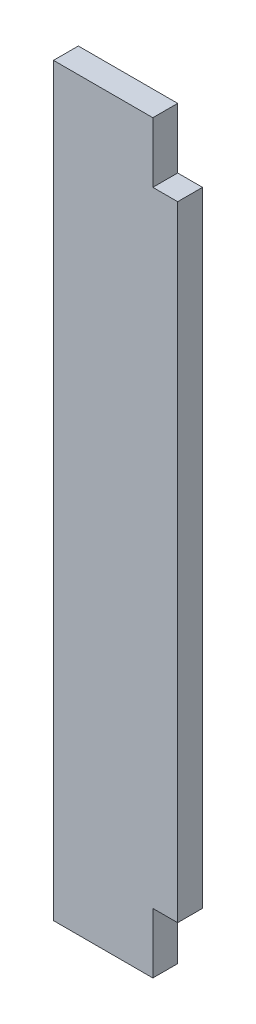
ISO-10303-21;
HEADER;
FILE_DESCRIPTION(('STEP AP214'),'2;1');
FILE_NAME('part.step','',(''),(''),'','','');
FILE_SCHEMA(('AUTOMOTIVE_DESIGN { 1 0 10303 214 1 1 1 1 }'));
ENDSEC;
DATA;
#1=APPLICATION_CONTEXT('core data for automotive mechanical design processes');
#2=APPLICATION_PROTOCOL_DEFINITION('international standard','automotive_design',2000,#1);
#3=PRODUCT_CONTEXT('',#1,'mechanical');
#4=PRODUCT('Part','Part','',(#3));
#5=PRODUCT_RELATED_PRODUCT_CATEGORY('part','',(#4));
#6=PRODUCT_DEFINITION_FORMATION('','',#4);
#7=PRODUCT_DEFINITION_CONTEXT('part definition',#1,'design');
#8=PRODUCT_DEFINITION('design','',#6,#7);
#9=PRODUCT_DEFINITION_SHAPE('','',#8);
#10=(LENGTH_UNIT() NAMED_UNIT(*) SI_UNIT(.MILLI.,.METRE.));
#11=(NAMED_UNIT(*) PLANE_ANGLE_UNIT() SI_UNIT($,.RADIAN.));
#12=(NAMED_UNIT(*) SI_UNIT($,.STERADIAN.) SOLID_ANGLE_UNIT());
#13=UNCERTAINTY_MEASURE_WITH_UNIT(LENGTH_MEASURE(1.E-05),#10,'distance_accuracy_value','');
#14=(GEOMETRIC_REPRESENTATION_CONTEXT(3) GLOBAL_UNCERTAINTY_ASSIGNED_CONTEXT((#13)) GLOBAL_UNIT_ASSIGNED_CONTEXT((#10,
#11,#12)) REPRESENTATION_CONTEXT('',''));
#15=CARTESIAN_POINT('',(0.,0.,0.));
#16=DIRECTION('',(0.,0.,1.));
#17=DIRECTION('',(1.,0.,0.));
#18=AXIS2_PLACEMENT_3D('',#15,#16,#17);
#19=CARTESIAN_POINT('',(11403.5416666658,-5808.6625,-17.78));
#20=DIRECTION('',(-1.,0.,0.));
#21=DIRECTION('',(0.,0.,1.));
#22=AXIS2_PLACEMENT_3D('',#19,#20,#21);
#23=PLANE('',#22);
#24=DIRECTION('',(0.,-1.,0.));
#25=VECTOR('',#24,1.);
#26=CARTESIAN_POINT('',(11403.5416666658,-5808.6625,0.));
#27=LINE('',#26,#25);
#28=CARTESIAN_POINT('',(11403.5416666658,-5808.6625,0.));
#29=VERTEX_POINT('',#28);
#30=CARTESIAN_POINT('',(11403.5416666658,-6342.0625,0.));
#31=VERTEX_POINT('',#30);
#32=EDGE_CURVE('E128',#29,#31,#27,.T.);
#33=ORIENTED_EDGE('',*,*,#32,.F.);
#34=DIRECTION('',(0.,0.,1.));
#35=VECTOR('',#34,1.);
#36=CARTESIAN_POINT('',(11403.5416666658,-5808.6625,-17.78));
#37=LINE('',#36,#35);
#38=CARTESIAN_POINT('',(11403.5416666658,-5808.6625,-17.78));
#39=VERTEX_POINT('',#38);
#40=EDGE_CURVE('E11',#39,#29,#37,.T.);
#41=ORIENTED_EDGE('',*,*,#40,.F.);
#42=DIRECTION('',(0.,-1.,0.));
#43=VECTOR('',#42,1.);
#44=CARTESIAN_POINT('',(11403.5416666658,-5808.6625,-17.78));
#45=LINE('',#44,#43);
#46=CARTESIAN_POINT('',(11403.5416666658,-6342.0625,-17.78));
#47=VERTEX_POINT('',#46);
#48=EDGE_CURVE('E148',#39,#47,#45,.T.);
#49=ORIENTED_EDGE('',*,*,#48,.T.);
#50=DIRECTION('',(0.,0.,1.));
#51=VECTOR('',#50,1.);
#52=CARTESIAN_POINT('',(11403.5416666658,-6342.0625,-17.78));
#53=LINE('',#52,#51);
#54=EDGE_CURVE('E34',#47,#31,#53,.T.);
#55=ORIENTED_EDGE('',*,*,#54,.T.);
#56=EDGE_LOOP('',(#33,#41,#49,#55));
#57=FACE_BOUND('',#56,.T.);
#58=ADVANCED_FACE('F31',(#57),#23,.T.);
#59=CARTESIAN_POINT('',(11474.6616666658,-5808.6625,-17.78));
#60=DIRECTION('',(0.,1.,0.));
#61=DIRECTION('',(0.,0.,1.));
#62=AXIS2_PLACEMENT_3D('',#59,#60,#61);
#63=PLANE('',#62);
#64=DIRECTION('',(-1.,0.,0.));
#65=VECTOR('',#64,1.);
#66=CARTESIAN_POINT('',(11474.6616666658,-5808.6625,0.));
#67=LINE('',#66,#65);
#68=CARTESIAN_POINT('',(11474.6616666658,-5808.6625,0.));
#69=VERTEX_POINT('',#68);
#70=EDGE_CURVE('E146',#69,#29,#67,.T.);
#71=ORIENTED_EDGE('',*,*,#70,.F.);
#72=DIRECTION('',(0.,0.,1.));
#73=VECTOR('',#72,1.);
#74=CARTESIAN_POINT('',(11474.6616666658,-5808.6625,-17.78));
#75=LINE('',#74,#73);
#76=CARTESIAN_POINT('',(11474.6616666658,-5808.6625,-17.78));
#77=VERTEX_POINT('',#76);
#78=EDGE_CURVE('E40',#77,#69,#75,.T.);
#79=ORIENTED_EDGE('',*,*,#78,.F.);
#80=DIRECTION('',(-1.,0.,0.));
#81=VECTOR('',#80,1.);
#82=CARTESIAN_POINT('',(11474.6616666658,-5808.6625,-17.78));
#83=LINE('',#82,#81);
#84=EDGE_CURVE('E118',#77,#39,#83,.T.);
#85=ORIENTED_EDGE('',*,*,#84,.T.);
#86=ORIENTED_EDGE('',*,*,#40,.T.);
#87=EDGE_LOOP('',(#71,#79,#85,#86));
#88=FACE_BOUND('',#87,.T.);
#89=ADVANCED_FACE('F160',(#88),#63,.T.);
#90=CARTESIAN_POINT('',(11474.6616666658,-5851.8425,-17.78));
#91=DIRECTION('',(1.,0.,0.));
#92=DIRECTION('',(0.,0.,-1.));
#93=AXIS2_PLACEMENT_3D('',#90,#91,#92);
#94=PLANE('',#93);
#95=DIRECTION('',(0.,1.,0.));
#96=VECTOR('',#95,1.);
#97=CARTESIAN_POINT('',(11474.6616666658,-5851.8425,0.));
#98=LINE('',#97,#96);
#99=CARTESIAN_POINT('',(11474.6616666658,-5851.8425,0.));
#100=VERTEX_POINT('',#99);
#101=EDGE_CURVE('E105',#100,#69,#98,.T.);
#102=ORIENTED_EDGE('',*,*,#101,.F.);
#103=DIRECTION('',(0.,0.,1.));
#104=VECTOR('',#103,1.);
#105=CARTESIAN_POINT('',(11474.6616666658,-5851.8425,-17.78));
#106=LINE('',#105,#104);
#107=CARTESIAN_POINT('',(11474.6616666658,-5851.8425,-17.78));
#108=VERTEX_POINT('',#107);
#109=EDGE_CURVE('E100',#108,#100,#106,.T.);
#110=ORIENTED_EDGE('',*,*,#109,.F.);
#111=DIRECTION('',(0.,1.,0.));
#112=VECTOR('',#111,1.);
#113=CARTESIAN_POINT('',(11474.6616666658,-5851.8425,-17.78));
#114=LINE('',#113,#112);
#115=EDGE_CURVE('E103',#108,#77,#114,.T.);
#116=ORIENTED_EDGE('',*,*,#115,.T.);
#117=ORIENTED_EDGE('',*,*,#78,.T.);
#118=EDGE_LOOP('',(#102,#110,#116,#117));
#119=FACE_BOUND('',#118,.T.);
#120=ADVANCED_FACE('F102',(#119),#94,.T.);
#121=CARTESIAN_POINT('',(11492.4416666658,-5851.8425,-17.78));
#122=DIRECTION('',(0.,1.,0.));
#123=DIRECTION('',(0.,0.,1.));
#124=AXIS2_PLACEMENT_3D('',#121,#122,#123);
#125=PLANE('',#124);
#126=DIRECTION('',(-1.,0.,0.));
#127=VECTOR('',#126,1.);
#128=CARTESIAN_POINT('',(11492.4416666658,-5851.8425,0.));
#129=LINE('',#128,#127);
#130=CARTESIAN_POINT('',(11492.4416666658,-5851.8425,0.));
#131=VERTEX_POINT('',#130);
#132=EDGE_CURVE('E143',#131,#100,#129,.T.);
#133=ORIENTED_EDGE('',*,*,#132,.F.);
#134=DIRECTION('',(0.,0.,1.));
#135=VECTOR('',#134,1.);
#136=CARTESIAN_POINT('',(11492.4416666658,-5851.8425,-17.78));
#137=LINE('',#136,#135);
#138=CARTESIAN_POINT('',(11492.4416666658,-5851.8425,-17.78));
#139=VERTEX_POINT('',#138);
#140=EDGE_CURVE('E110',#139,#131,#137,.T.);
#141=ORIENTED_EDGE('',*,*,#140,.F.);
#142=DIRECTION('',(-1.,0.,0.));
#143=VECTOR('',#142,1.);
#144=CARTESIAN_POINT('',(11492.4416666658,-5851.8425,-17.78));
#145=LINE('',#144,#143);
#146=EDGE_CURVE('E116',#139,#108,#145,.T.);
#147=ORIENTED_EDGE('',*,*,#146,.T.);
#148=ORIENTED_EDGE('',*,*,#109,.T.);
#149=EDGE_LOOP('',(#133,#141,#147,#148));
#150=FACE_BOUND('',#149,.T.);
#151=ADVANCED_FACE('F120',(#150),#125,.T.);
#152=CARTESIAN_POINT('',(11492.4416666658,-6298.8825,-17.78));
#153=DIRECTION('',(1.,0.,0.));
#154=DIRECTION('',(0.,0.,-1.));
#155=AXIS2_PLACEMENT_3D('',#152,#153,#154);
#156=PLANE('',#155);
#157=DIRECTION('',(0.,1.,0.));
#158=VECTOR('',#157,1.);
#159=CARTESIAN_POINT('',(11492.4416666658,-6298.8825,0.));
#160=LINE('',#159,#158);
#161=CARTESIAN_POINT('',(11492.4416666658,-6298.8825,0.));
#162=VERTEX_POINT('',#161);
#163=EDGE_CURVE('E140',#162,#131,#160,.T.);
#164=ORIENTED_EDGE('',*,*,#163,.F.);
#165=DIRECTION('',(0.,0.,1.));
#166=VECTOR('',#165,1.);
#167=CARTESIAN_POINT('',(11492.4416666658,-6298.8825,-17.78));
#168=LINE('',#167,#166);
#169=CARTESIAN_POINT('',(11492.4416666658,-6298.8825,-17.78));
#170=VERTEX_POINT('',#169);
#171=EDGE_CURVE('E152',#170,#162,#168,.T.);
#172=ORIENTED_EDGE('',*,*,#171,.F.);
#173=DIRECTION('',(0.,1.,0.));
#174=VECTOR('',#173,1.);
#175=CARTESIAN_POINT('',(11492.4416666658,-6298.8825,-17.78));
#176=LINE('',#175,#174);
#177=EDGE_CURVE('E121',#170,#139,#176,.T.);
#178=ORIENTED_EDGE('',*,*,#177,.T.);
#179=ORIENTED_EDGE('',*,*,#140,.T.);
#180=EDGE_LOOP('',(#164,#172,#178,#179));
#181=FACE_BOUND('',#180,.T.);
#182=ADVANCED_FACE('F173',(#181),#156,.T.);
#183=CARTESIAN_POINT('',(11474.6616666658,-6298.8825,-17.78));
#184=DIRECTION('',(0.,-1.,0.));
#185=DIRECTION('',(0.,0.,-1.));
#186=AXIS2_PLACEMENT_3D('',#183,#184,#185);
#187=PLANE('',#186);
#188=DIRECTION('',(1.,0.,0.));
#189=VECTOR('',#188,1.);
#190=CARTESIAN_POINT('',(11474.6616666658,-6298.8825,0.));
#191=LINE('',#190,#189);
#192=CARTESIAN_POINT('',(11474.6616666658,-6298.8825,0.));
#193=VERTEX_POINT('',#192);
#194=EDGE_CURVE('E137',#193,#162,#191,.T.);
#195=ORIENTED_EDGE('',*,*,#194,.F.);
#196=DIRECTION('',(0.,0.,1.));
#197=VECTOR('',#196,1.);
#198=CARTESIAN_POINT('',(11474.6616666658,-6298.8825,-17.78));
#199=LINE('',#198,#197);
#200=CARTESIAN_POINT('',(11474.6616666658,-6298.8825,-17.78));
#201=VERTEX_POINT('',#200);
#202=EDGE_CURVE('E154',#201,#193,#199,.T.);
#203=ORIENTED_EDGE('',*,*,#202,.F.);
#204=DIRECTION('',(1.,0.,0.));
#205=VECTOR('',#204,1.);
#206=CARTESIAN_POINT('',(11474.6616666658,-6298.8825,-17.78));
#207=LINE('',#206,#205);
#208=EDGE_CURVE('E123',#201,#170,#207,.T.);
#209=ORIENTED_EDGE('',*,*,#208,.T.);
#210=ORIENTED_EDGE('',*,*,#171,.T.);
#211=EDGE_LOOP('',(#195,#203,#209,#210));
#212=FACE_BOUND('',#211,.T.);
#213=ADVANCED_FACE('F176',(#212),#187,.T.);
#214=CARTESIAN_POINT('',(11474.6616666658,-6342.0625,-17.78));
#215=DIRECTION('',(1.,0.,0.));
#216=DIRECTION('',(0.,0.,-1.));
#217=AXIS2_PLACEMENT_3D('',#214,#215,#216);
#218=PLANE('',#217);
#219=DIRECTION('',(0.,1.,0.));
#220=VECTOR('',#219,1.);
#221=CARTESIAN_POINT('',(11474.6616666658,-6342.0625,0.));
#222=LINE('',#221,#220);
#223=CARTESIAN_POINT('',(11474.6616666658,-6342.0625,0.));
#224=VERTEX_POINT('',#223);
#225=EDGE_CURVE('E134',#224,#193,#222,.T.);
#226=ORIENTED_EDGE('',*,*,#225,.F.);
#227=DIRECTION('',(0.,0.,1.));
#228=VECTOR('',#227,1.);
#229=CARTESIAN_POINT('',(11474.6616666658,-6342.0625,-17.78));
#230=LINE('',#229,#228);
#231=CARTESIAN_POINT('',(11474.6616666658,-6342.0625,-17.78));
#232=VERTEX_POINT('',#231);
#233=EDGE_CURVE('E155',#232,#224,#230,.T.);
#234=ORIENTED_EDGE('',*,*,#233,.F.);
#235=DIRECTION('',(0.,1.,0.));
#236=VECTOR('',#235,1.);
#237=CARTESIAN_POINT('',(11474.6616666658,-6342.0625,-17.78));
#238=LINE('',#237,#236);
#239=EDGE_CURVE('E251',#232,#201,#238,.T.);
#240=ORIENTED_EDGE('',*,*,#239,.T.);
#241=ORIENTED_EDGE('',*,*,#202,.T.);
#242=EDGE_LOOP('',(#226,#234,#240,#241));
#243=FACE_BOUND('',#242,.T.);
#244=ADVANCED_FACE('F180',(#243),#218,.T.);
#245=CARTESIAN_POINT('',(11403.5416666658,-6342.0625,-17.78));
#246=DIRECTION('',(0.,-1.,0.));
#247=DIRECTION('',(0.,0.,-1.));
#248=AXIS2_PLACEMENT_3D('',#245,#246,#247);
#249=PLANE('',#248);
#250=DIRECTION('',(1.,0.,0.));
#251=VECTOR('',#250,1.);
#252=CARTESIAN_POINT('',(11403.5416666658,-6342.0625,0.));
#253=LINE('',#252,#251);
#254=EDGE_CURVE('E131',#31,#224,#253,.T.);
#255=ORIENTED_EDGE('',*,*,#254,.F.);
#256=ORIENTED_EDGE('',*,*,#54,.F.);
#257=DIRECTION('',(1.,0.,0.));
#258=VECTOR('',#257,1.);
#259=CARTESIAN_POINT('',(11403.5416666658,-6342.0625,-17.78));
#260=LINE('',#259,#258);
#261=EDGE_CURVE('E252',#47,#232,#260,.T.);
#262=ORIENTED_EDGE('',*,*,#261,.T.);
#263=ORIENTED_EDGE('',*,*,#233,.T.);
#264=EDGE_LOOP('',(#255,#256,#262,#263));
#265=FACE_BOUND('',#264,.T.);
#266=ADVANCED_FACE('F157',(#265),#249,.T.);
#267=CARTESIAN_POINT('',(11403.5416666658,-6342.0625,-17.78));
#268=DIRECTION('',(0.,0.,1.));
#269=DIRECTION('',(1.,0.,0.));
#270=AXIS2_PLACEMENT_3D('',#267,#268,#269);
#271=PLANE('',#270);
#272=ORIENTED_EDGE('',*,*,#48,.F.);
#273=ORIENTED_EDGE('',*,*,#84,.F.);
#274=ORIENTED_EDGE('',*,*,#115,.F.);
#275=ORIENTED_EDGE('',*,*,#146,.F.);
#276=ORIENTED_EDGE('',*,*,#177,.F.);
#277=ORIENTED_EDGE('',*,*,#208,.F.);
#278=ORIENTED_EDGE('',*,*,#239,.F.);
#279=ORIENTED_EDGE('',*,*,#261,.F.);
#280=EDGE_LOOP('',(#272,#273,#274,#275,#276,#277,#278,#279));
#281=FACE_BOUND('',#280,.T.);
#282=ADVANCED_FACE('F114',(#281),#271,.F.);
#283=CARTESIAN_POINT('',(11403.5416666658,-6342.0625,0.));
#284=DIRECTION('',(0.,0.,1.));
#285=DIRECTION('',(1.,0.,0.));
#286=AXIS2_PLACEMENT_3D('',#283,#284,#285);
#287=PLANE('',#286);
#288=ORIENTED_EDGE('',*,*,#32,.T.);
#289=ORIENTED_EDGE('',*,*,#254,.T.);
#290=ORIENTED_EDGE('',*,*,#225,.T.);
#291=ORIENTED_EDGE('',*,*,#194,.T.);
#292=ORIENTED_EDGE('',*,*,#163,.T.);
#293=ORIENTED_EDGE('',*,*,#132,.T.);
#294=ORIENTED_EDGE('',*,*,#101,.T.);
#295=ORIENTED_EDGE('',*,*,#70,.T.);
#296=EDGE_LOOP('',(#288,#289,#290,#291,#292,#293,#294,#295));
#297=FACE_BOUND('',#296,.T.);
#298=ADVANCED_FACE('F159',(#297),#287,.T.);
#299=CLOSED_SHELL('',(#58,#89,#120,#151,#182,#213,#244,#266,#282,#298));
#300=MANIFOLD_SOLID_BREP('B2',#299);
#301=ADVANCED_BREP_SHAPE_REPRESENTATION('',(#18,#300),#14);
#302=SHAPE_DEFINITION_REPRESENTATION(#9,#301);
ENDSEC;
END-ISO-10303-21;
